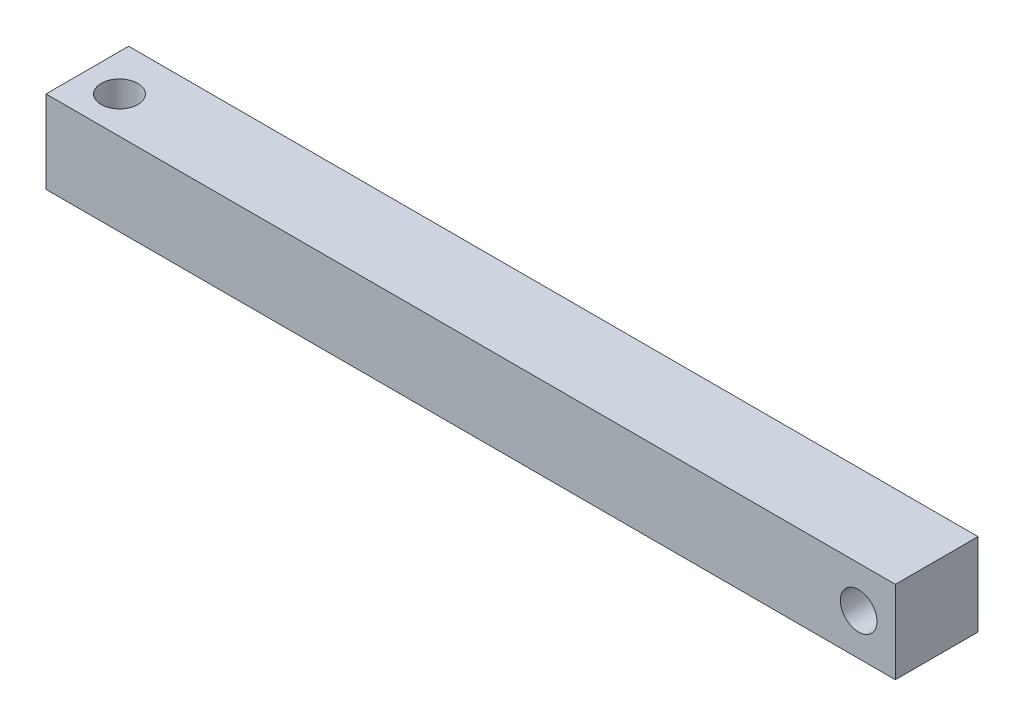
ISO-10303-21;
HEADER;
FILE_DESCRIPTION(('STEP AP214'),'2;1');
FILE_NAME('part.step','',(''),(''),'','','');
FILE_SCHEMA(('AUTOMOTIVE_DESIGN { 1 0 10303 214 1 1 1 1 }'));
ENDSEC;
DATA;
#1=APPLICATION_CONTEXT('core data for automotive mechanical design processes');
#2=APPLICATION_PROTOCOL_DEFINITION('international standard','automotive_design',2000,#1);
#3=PRODUCT_CONTEXT('',#1,'mechanical');
#4=PRODUCT('Part','Part','',(#3));
#5=PRODUCT_RELATED_PRODUCT_CATEGORY('part','',(#4));
#6=PRODUCT_DEFINITION_FORMATION('','',#4);
#7=PRODUCT_DEFINITION_CONTEXT('part definition',#1,'design');
#8=PRODUCT_DEFINITION('design','',#6,#7);
#9=PRODUCT_DEFINITION_SHAPE('','',#8);
#10=(LENGTH_UNIT() NAMED_UNIT(*) SI_UNIT(.MILLI.,.METRE.));
#11=(NAMED_UNIT(*) PLANE_ANGLE_UNIT() SI_UNIT($,.RADIAN.));
#12=(NAMED_UNIT(*) SI_UNIT($,.STERADIAN.) SOLID_ANGLE_UNIT());
#13=UNCERTAINTY_MEASURE_WITH_UNIT(LENGTH_MEASURE(1.E-05),#10,'distance_accuracy_value','');
#14=(GEOMETRIC_REPRESENTATION_CONTEXT(3) GLOBAL_UNCERTAINTY_ASSIGNED_CONTEXT((#13)) GLOBAL_UNIT_ASSIGNED_CONTEXT((#10,
#11,#12)) REPRESENTATION_CONTEXT('',''));
#15=CARTESIAN_POINT('',(0.,0.,0.));
#16=DIRECTION('',(0.,0.,1.));
#17=DIRECTION('',(1.,0.,0.));
#18=AXIS2_PLACEMENT_3D('',#15,#16,#17);
#19=CARTESIAN_POINT('',(-41.779872622036,12.0275390881619,3.6));
#20=DIRECTION('',(1.,0.,0.));
#21=DIRECTION('',(0.,0.,-1.));
#22=AXIS2_PLACEMENT_3D('',#19,#20,#21);
#23=PLANE('',#22);
#24=DIRECTION('',(0.,-1.,0.));
#25=VECTOR('',#24,1.);
#26=CARTESIAN_POINT('',(-41.779872622036,12.0275390881619,0.));
#27=LINE('',#26,#25);
#28=CARTESIAN_POINT('',(-41.779872622036,12.0275390881619,0.));
#29=VERTEX_POINT('',#28);
#30=CARTESIAN_POINT('',(-41.779872622036,8.42753908816187,0.));
#31=VERTEX_POINT('',#30);
#32=EDGE_CURVE('E96',#29,#31,#27,.T.);
#33=ORIENTED_EDGE('',*,*,#32,.T.);
#34=DIRECTION('',(0.,0.,-1.));
#35=VECTOR('',#34,1.);
#36=CARTESIAN_POINT('',(-41.779872622036,8.42753908816187,3.6));
#37=LINE('',#36,#35);
#38=CARTESIAN_POINT('',(-41.779872622036,8.42753908816187,3.6));
#39=VERTEX_POINT('',#38);
#40=EDGE_CURVE('E11',#39,#31,#37,.T.);
#41=ORIENTED_EDGE('',*,*,#40,.F.);
#42=DIRECTION('',(0.,-1.,0.));
#43=VECTOR('',#42,1.);
#44=CARTESIAN_POINT('',(-41.779872622036,12.0275390881619,3.6));
#45=LINE('',#44,#43);
#46=CARTESIAN_POINT('',(-41.779872622036,12.0275390881619,3.6));
#47=VERTEX_POINT('',#46);
#48=EDGE_CURVE('E84',#47,#39,#45,.T.);
#49=ORIENTED_EDGE('',*,*,#48,.F.);
#50=DIRECTION('',(0.,0.,-1.));
#51=VECTOR('',#50,1.);
#52=CARTESIAN_POINT('',(-41.779872622036,12.0275390881619,3.6));
#53=LINE('',#52,#51);
#54=EDGE_CURVE('E92',#47,#29,#53,.T.);
#55=ORIENTED_EDGE('',*,*,#54,.T.);
#56=EDGE_LOOP('',(#33,#41,#49,#55));
#57=FACE_BOUND('',#56,.T.);
#58=ADVANCED_FACE('F33',(#57),#23,.F.);
#59=CARTESIAN_POINT('',(-41.779872622036,8.42753908816187,3.6));
#60=DIRECTION('',(0.,1.,0.));
#61=DIRECTION('',(0.,0.,1.));
#62=AXIS2_PLACEMENT_3D('',#59,#60,#61);
#63=PLANE('',#62);
#64=CARTESIAN_POINT('',(-40.179872622036,8.42753908816187,2.));
#65=DIRECTION('',(0.,-1.,0.));
#66=DIRECTION('',(0.,0.,-1.));
#67=AXIS2_PLACEMENT_3D('',#64,#65,#66);
#68=CIRCLE('',#67,0.800000000000003);
#69=CARTESIAN_POINT('',(-40.179872622036,8.42753908816187,1.2));
#70=VERTEX_POINT('',#69);
#71=EDGE_CURVE('E116',#70,#70,#68,.T.);
#72=ORIENTED_EDGE('',*,*,#71,.F.);
#73=EDGE_LOOP('',(#72));
#74=FACE_BOUND('',#73,.T.);
#75=DIRECTION('',(1.,0.,0.));
#76=VECTOR('',#75,1.);
#77=CARTESIAN_POINT('',(-41.779872622036,8.42753908816187,0.));
#78=LINE('',#77,#76);
#79=CARTESIAN_POINT('',(-4.77987262203598,8.42753908816187,0.));
#80=VERTEX_POINT('',#79);
#81=EDGE_CURVE('E88',#31,#80,#78,.T.);
#82=ORIENTED_EDGE('',*,*,#81,.T.);
#83=DIRECTION('',(0.,0.,-1.));
#84=VECTOR('',#83,1.);
#85=CARTESIAN_POINT('',(-4.77987262203598,8.42753908816187,3.6));
#86=LINE('',#85,#84);
#87=CARTESIAN_POINT('',(-4.77987262203598,8.42753908816187,3.6));
#88=VERTEX_POINT('',#87);
#89=EDGE_CURVE('E41',#88,#80,#86,.T.);
#90=ORIENTED_EDGE('',*,*,#89,.F.);
#91=DIRECTION('',(1.,0.,0.));
#92=VECTOR('',#91,1.);
#93=CARTESIAN_POINT('',(-41.779872622036,8.42753908816187,3.6));
#94=LINE('',#93,#92);
#95=EDGE_CURVE('E79',#39,#88,#94,.T.);
#96=ORIENTED_EDGE('',*,*,#95,.F.);
#97=ORIENTED_EDGE('',*,*,#40,.T.);
#98=EDGE_LOOP('',(#82,#90,#96,#97));
#99=FACE_BOUND('',#98,.T.);
#100=ADVANCED_FACE('F87',(#74,#99),#63,.F.);
#101=CARTESIAN_POINT('',(-4.77987262203598,12.0275390881619,3.6));
#102=DIRECTION('',(-1.,0.,0.));
#103=DIRECTION('',(0.,0.,1.));
#104=AXIS2_PLACEMENT_3D('',#101,#102,#103);
#105=PLANE('',#104);
#106=DIRECTION('',(0.,1.,0.));
#107=VECTOR('',#106,1.);
#108=CARTESIAN_POINT('',(-4.77987262203598,12.0275390881619,0.));
#109=LINE('',#108,#107);
#110=CARTESIAN_POINT('',(-4.77987262203598,12.0275390881619,0.));
#111=VERTEX_POINT('',#110);
#112=EDGE_CURVE('E66',#80,#111,#109,.T.);
#113=ORIENTED_EDGE('',*,*,#112,.T.);
#114=DIRECTION('',(0.,0.,-1.));
#115=VECTOR('',#114,1.);
#116=CARTESIAN_POINT('',(-4.77987262203598,12.0275390881619,3.6));
#117=LINE('',#116,#115);
#118=CARTESIAN_POINT('',(-4.77987262203598,12.0275390881619,3.6));
#119=VERTEX_POINT('',#118);
#120=EDGE_CURVE('E89',#119,#111,#117,.T.);
#121=ORIENTED_EDGE('',*,*,#120,.F.);
#122=DIRECTION('',(0.,1.,0.));
#123=VECTOR('',#122,1.);
#124=CARTESIAN_POINT('',(-4.77987262203598,12.0275390881619,3.6));
#125=LINE('',#124,#123);
#126=EDGE_CURVE('E82',#88,#119,#125,.T.);
#127=ORIENTED_EDGE('',*,*,#126,.F.);
#128=ORIENTED_EDGE('',*,*,#89,.T.);
#129=EDGE_LOOP('',(#113,#121,#127,#128));
#130=FACE_BOUND('',#129,.T.);
#131=ADVANCED_FACE('F90',(#130),#105,.F.);
#132=CARTESIAN_POINT('',(-41.779872622036,12.0275390881619,3.6));
#133=DIRECTION('',(0.,-1.,0.));
#134=DIRECTION('',(0.,0.,-1.));
#135=AXIS2_PLACEMENT_3D('',#132,#133,#134);
#136=PLANE('',#135);
#137=CARTESIAN_POINT('',(-40.179872622036,12.0275390881619,2.));
#138=DIRECTION('',(0.,-1.,0.));
#139=DIRECTION('',(0.,0.,-1.));
#140=AXIS2_PLACEMENT_3D('',#137,#138,#139);
#141=CIRCLE('',#140,0.800000000000003);
#142=CARTESIAN_POINT('',(-40.179872622036,12.0275390881619,1.2));
#143=VERTEX_POINT('',#142);
#144=EDGE_CURVE('E113',#143,#143,#141,.T.);
#145=ORIENTED_EDGE('',*,*,#144,.T.);
#146=EDGE_LOOP('',(#145));
#147=FACE_BOUND('',#146,.T.);
#148=DIRECTION('',(-1.,0.,0.));
#149=VECTOR('',#148,1.);
#150=CARTESIAN_POINT('',(-41.779872622036,12.0275390881619,0.));
#151=LINE('',#150,#149);
#152=EDGE_CURVE('E72',#111,#29,#151,.T.);
#153=ORIENTED_EDGE('',*,*,#152,.T.);
#154=ORIENTED_EDGE('',*,*,#54,.F.);
#155=DIRECTION('',(-1.,0.,0.));
#156=VECTOR('',#155,1.);
#157=CARTESIAN_POINT('',(-41.779872622036,12.0275390881619,3.6));
#158=LINE('',#157,#156);
#159=EDGE_CURVE('E49',#119,#47,#158,.T.);
#160=ORIENTED_EDGE('',*,*,#159,.F.);
#161=ORIENTED_EDGE('',*,*,#120,.T.);
#162=EDGE_LOOP('',(#153,#154,#160,#161));
#163=FACE_BOUND('',#162,.T.);
#164=ADVANCED_FACE('F104',(#147,#163),#136,.F.);
#165=CARTESIAN_POINT('',(0.,0.,3.6));
#166=DIRECTION('',(0.,0.,1.));
#167=DIRECTION('',(1.,0.,0.));
#168=AXIS2_PLACEMENT_3D('',#165,#166,#167);
#169=PLANE('',#168);
#170=CARTESIAN_POINT('',(-6.37987262203598,10.2275390881619,3.6));
#171=DIRECTION('',(0.,0.,1.));
#172=DIRECTION('',(1.,0.,0.));
#173=AXIS2_PLACEMENT_3D('',#170,#171,#172);
#174=CIRCLE('',#173,0.800000000000001);
#175=CARTESIAN_POINT('',(-5.57987262203597,10.2275390881619,3.6));
#176=VERTEX_POINT('',#175);
#177=EDGE_CURVE('E110',#176,#176,#174,.T.);
#178=ORIENTED_EDGE('',*,*,#177,.F.);
#179=EDGE_LOOP('',(#178));
#180=FACE_BOUND('',#179,.T.);
#181=ORIENTED_EDGE('',*,*,#48,.T.);
#182=ORIENTED_EDGE('',*,*,#95,.T.);
#183=ORIENTED_EDGE('',*,*,#126,.T.);
#184=ORIENTED_EDGE('',*,*,#159,.T.);
#185=EDGE_LOOP('',(#181,#182,#183,#184));
#186=FACE_BOUND('',#185,.T.);
#187=ADVANCED_FACE('F80',(#180,#186),#169,.T.);
#188=CARTESIAN_POINT('',(0.,0.,0.));
#189=DIRECTION('',(0.,0.,1.));
#190=DIRECTION('',(1.,0.,0.));
#191=AXIS2_PLACEMENT_3D('',#188,#189,#190);
#192=PLANE('',#191);
#193=CARTESIAN_POINT('',(-6.37987262203598,10.2275390881619,0.));
#194=DIRECTION('',(0.,0.,1.));
#195=DIRECTION('',(1.,0.,0.));
#196=AXIS2_PLACEMENT_3D('',#193,#194,#195);
#197=CIRCLE('',#196,0.800000000000001);
#198=CARTESIAN_POINT('',(-5.57987262203597,10.2275390881619,0.));
#199=VERTEX_POINT('',#198);
#200=EDGE_CURVE('E99',#199,#199,#197,.T.);
#201=ORIENTED_EDGE('',*,*,#200,.T.);
#202=EDGE_LOOP('',(#201));
#203=FACE_BOUND('',#202,.T.);
#204=ORIENTED_EDGE('',*,*,#32,.F.);
#205=ORIENTED_EDGE('',*,*,#152,.F.);
#206=ORIENTED_EDGE('',*,*,#112,.F.);
#207=ORIENTED_EDGE('',*,*,#81,.F.);
#208=EDGE_LOOP('',(#204,#205,#206,#207));
#209=FACE_BOUND('',#208,.T.);
#210=ADVANCED_FACE('F107',(#203,#209),#192,.F.);
#211=CARTESIAN_POINT('',(-6.37987262203598,10.2275390881619,0.));
#212=DIRECTION('',(0.,0.,1.));
#213=DIRECTION('',(1.,0.,0.));
#214=AXIS2_PLACEMENT_3D('',#211,#212,#213);
#215=CYLINDRICAL_SURFACE('',#214,0.800000000000001);
#216=ORIENTED_EDGE('',*,*,#200,.F.);
#217=EDGE_LOOP('',(#216));
#218=FACE_BOUND('',#217,.T.);
#219=ORIENTED_EDGE('',*,*,#177,.T.);
#220=EDGE_LOOP('',(#219));
#221=FACE_BOUND('',#220,.T.);
#222=ADVANCED_FACE('F126',(#218,#221),#215,.F.);
#223=CARTESIAN_POINT('',(-40.179872622036,12.0275390881619,2.));
#224=DIRECTION('',(0.,-1.,0.));
#225=DIRECTION('',(0.,0.,-1.));
#226=AXIS2_PLACEMENT_3D('',#223,#224,#225);
#227=CYLINDRICAL_SURFACE('',#226,0.800000000000003);
#228=ORIENTED_EDGE('',*,*,#144,.F.);
#229=EDGE_LOOP('',(#228));
#230=FACE_BOUND('',#229,.T.);
#231=ORIENTED_EDGE('',*,*,#71,.T.);
#232=EDGE_LOOP('',(#231));
#233=FACE_BOUND('',#232,.T.);
#234=ADVANCED_FACE('F123',(#230,#233),#227,.F.);
#235=CLOSED_SHELL('',(#58,#100,#131,#164,#187,#210,#222,#234));
#236=MANIFOLD_SOLID_BREP('B2',#235);
#237=ADVANCED_BREP_SHAPE_REPRESENTATION('',(#18,#236),#14);
#238=SHAPE_DEFINITION_REPRESENTATION(#9,#237);
ENDSEC;
END-ISO-10303-21;
